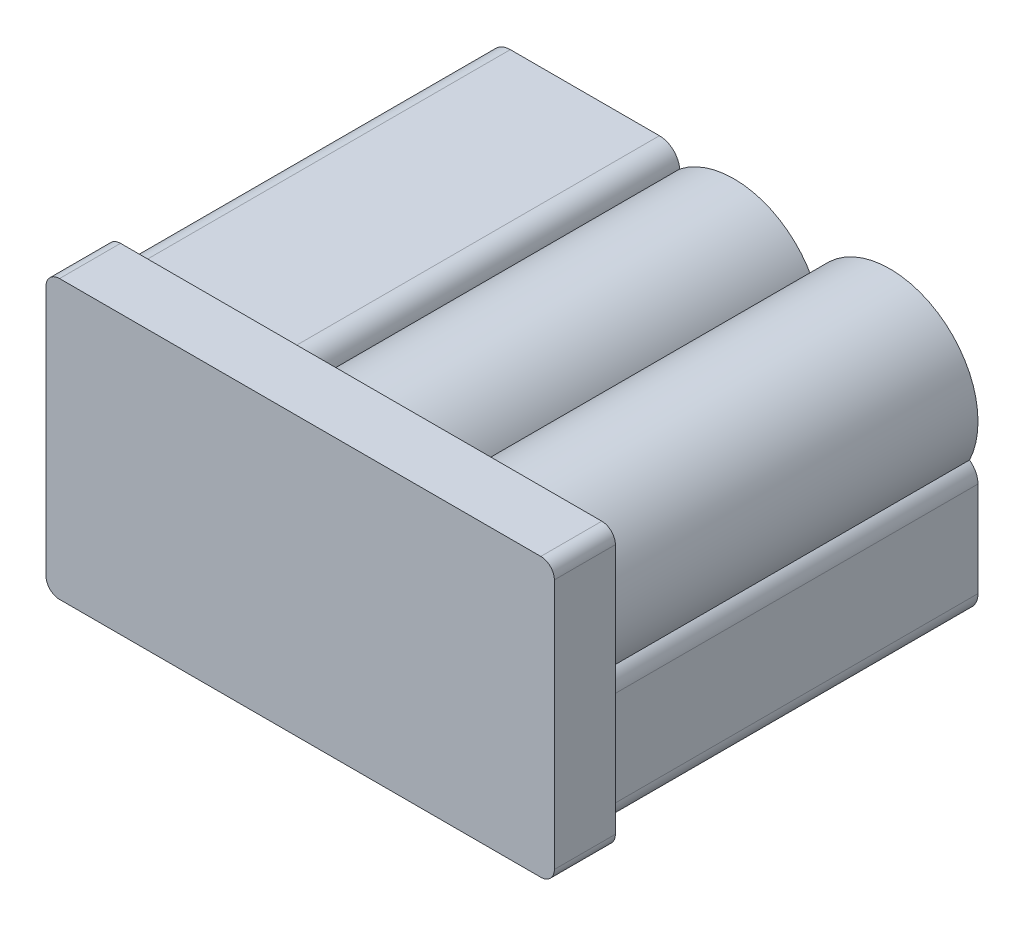
ISO-10303-21;
HEADER;
FILE_DESCRIPTION(('STEP AP214'),'2;1');
FILE_NAME('part.step','',(''),(''),'','','');
FILE_SCHEMA(('AUTOMOTIVE_DESIGN { 1 0 10303 214 1 1 1 1 }'));
ENDSEC;
DATA;
#1=APPLICATION_CONTEXT('core data for automotive mechanical design processes');
#2=APPLICATION_PROTOCOL_DEFINITION('international standard','automotive_design',2000,#1);
#3=PRODUCT_CONTEXT('',#1,'mechanical');
#4=PRODUCT('Part','Part','',(#3));
#5=PRODUCT_RELATED_PRODUCT_CATEGORY('part','',(#4));
#6=PRODUCT_DEFINITION_FORMATION('','',#4);
#7=PRODUCT_DEFINITION_CONTEXT('part definition',#1,'design');
#8=PRODUCT_DEFINITION('design','',#6,#7);
#9=PRODUCT_DEFINITION_SHAPE('','',#8);
#10=(LENGTH_UNIT() NAMED_UNIT(*) SI_UNIT(.MILLI.,.METRE.));
#11=(NAMED_UNIT(*) PLANE_ANGLE_UNIT() SI_UNIT($,.RADIAN.));
#12=(NAMED_UNIT(*) SI_UNIT($,.STERADIAN.) SOLID_ANGLE_UNIT());
#13=UNCERTAINTY_MEASURE_WITH_UNIT(LENGTH_MEASURE(1.E-05),#10,'distance_accuracy_value','');
#14=(GEOMETRIC_REPRESENTATION_CONTEXT(3) GLOBAL_UNCERTAINTY_ASSIGNED_CONTEXT((#13)) GLOBAL_UNIT_ASSIGNED_CONTEXT((#10,
#11,#12)) REPRESENTATION_CONTEXT('',''));
#15=CARTESIAN_POINT('',(0.,0.,0.));
#16=DIRECTION('',(0.,0.,1.));
#17=DIRECTION('',(1.,0.,0.));
#18=AXIS2_PLACEMENT_3D('',#15,#16,#17);
#19=CARTESIAN_POINT('',(119.0625,-65.0875,203.2));
#20=DIRECTION('',(-1.,0.,0.));
#21=DIRECTION('',(0.,0.,1.));
#22=AXIS2_PLACEMENT_3D('',#19,#20,#21);
#23=PLANE('',#22);
#24=DIRECTION('',(0.,1.,0.));
#25=VECTOR('',#24,1.);
#26=CARTESIAN_POINT('',(119.0625,-65.0875,203.2));
#27=LINE('',#26,#25);
#28=CARTESIAN_POINT('',(119.0625,-58.7375,203.2));
#29=VERTEX_POINT('',#28);
#30=CARTESIAN_POINT('',(119.0625,58.7375,203.2));
#31=VERTEX_POINT('',#30);
#32=EDGE_CURVE('E293',#29,#31,#27,.T.);
#33=ORIENTED_EDGE('',*,*,#32,.F.);
#34=DIRECTION('',(0.,0.,-1.));
#35=VECTOR('',#34,1.);
#36=CARTESIAN_POINT('',(119.0625,-58.7375,203.2));
#37=LINE('',#36,#35);
#38=CARTESIAN_POINT('',(119.0625,-58.7375,174.625));
#39=VERTEX_POINT('',#38);
#40=EDGE_CURVE('E11',#29,#39,#37,.T.);
#41=ORIENTED_EDGE('',*,*,#40,.T.);
#42=DIRECTION('',(0.,-1.,0.));
#43=VECTOR('',#42,1.);
#44=CARTESIAN_POINT('',(119.0625,0.,174.625));
#45=LINE('',#44,#43);
#46=CARTESIAN_POINT('',(119.0625,58.7375,174.625));
#47=VERTEX_POINT('',#46);
#48=EDGE_CURVE('E245',#47,#39,#45,.T.);
#49=ORIENTED_EDGE('',*,*,#48,.F.);
#50=DIRECTION('',(0.,0.,-1.));
#51=VECTOR('',#50,1.);
#52=CARTESIAN_POINT('',(119.0625,58.7375,203.2));
#53=LINE('',#52,#51);
#54=EDGE_CURVE('E44',#47,#31,#53,.F.);
#55=ORIENTED_EDGE('',*,*,#54,.T.);
#56=EDGE_LOOP('',(#33,#41,#49,#55));
#57=FACE_BOUND('',#56,.T.);
#58=ADVANCED_FACE('F36',(#57),#23,.F.);
#59=CARTESIAN_POINT('',(-119.0625,65.0875,203.2));
#60=DIRECTION('',(0.,-1.,0.));
#61=DIRECTION('',(0.,0.,-1.));
#62=AXIS2_PLACEMENT_3D('',#59,#60,#61);
#63=PLANE('',#62);
#64=DIRECTION('',(1.,0.,0.));
#65=VECTOR('',#64,1.);
#66=CARTESIAN_POINT('',(-211.228306266812,65.0875,174.625));
#67=LINE('',#66,#65);
#68=CARTESIAN_POINT('',(-112.7125,65.0875,174.625));
#69=VERTEX_POINT('',#68);
#70=CARTESIAN_POINT('',(112.7125,65.0875,174.625));
#71=VERTEX_POINT('',#70);
#72=EDGE_CURVE('E242',#69,#71,#67,.T.);
#73=ORIENTED_EDGE('',*,*,#72,.F.);
#74=DIRECTION('',(0.,0.,-1.));
#75=VECTOR('',#74,1.);
#76=CARTESIAN_POINT('',(-112.7125,65.0875,203.2));
#77=LINE('',#76,#75);
#78=CARTESIAN_POINT('',(-112.7125,65.0875,203.2));
#79=VERTEX_POINT('',#78);
#80=EDGE_CURVE('E51',#69,#79,#77,.F.);
#81=ORIENTED_EDGE('',*,*,#80,.T.);
#82=DIRECTION('',(-1.,0.,0.));
#83=VECTOR('',#82,1.);
#84=CARTESIAN_POINT('',(-119.0625,65.0875,203.2));
#85=LINE('',#84,#83);
#86=CARTESIAN_POINT('',(112.7125,65.0875,203.2));
#87=VERTEX_POINT('',#86);
#88=EDGE_CURVE('E318',#87,#79,#85,.T.);
#89=ORIENTED_EDGE('',*,*,#88,.F.);
#90=DIRECTION('',(0.,0.,-1.));
#91=VECTOR('',#90,1.);
#92=CARTESIAN_POINT('',(112.7125,65.0875,203.2));
#93=LINE('',#92,#91);
#94=EDGE_CURVE('E351',#87,#71,#93,.T.);
#95=ORIENTED_EDGE('',*,*,#94,.T.);
#96=EDGE_LOOP('',(#73,#81,#89,#95));
#97=FACE_BOUND('',#96,.T.);
#98=ADVANCED_FACE('F363',(#97),#63,.F.);
#99=CARTESIAN_POINT('',(-119.0625,-65.0875,203.2));
#100=DIRECTION('',(1.,0.,0.));
#101=DIRECTION('',(0.,0.,-1.));
#102=AXIS2_PLACEMENT_3D('',#99,#100,#101);
#103=PLANE('',#102);
#104=DIRECTION('',(0.,1.,0.));
#105=VECTOR('',#104,1.);
#106=CARTESIAN_POINT('',(-119.0625,0.,174.625));
#107=LINE('',#106,#105);
#108=CARTESIAN_POINT('',(-119.0625,-58.7375,174.625));
#109=VERTEX_POINT('',#108);
#110=CARTESIAN_POINT('',(-119.0625,58.7375,174.625));
#111=VERTEX_POINT('',#110);
#112=EDGE_CURVE('E198',#109,#111,#107,.T.);
#113=ORIENTED_EDGE('',*,*,#112,.F.);
#114=DIRECTION('',(0.,0.,-1.));
#115=VECTOR('',#114,1.);
#116=CARTESIAN_POINT('',(-119.0625,-58.7375,203.2));
#117=LINE('',#116,#115);
#118=CARTESIAN_POINT('',(-119.0625,-58.7375,203.2));
#119=VERTEX_POINT('',#118);
#120=EDGE_CURVE('E342',#109,#119,#117,.F.);
#121=ORIENTED_EDGE('',*,*,#120,.T.);
#122=DIRECTION('',(0.,-1.,0.));
#123=VECTOR('',#122,1.);
#124=CARTESIAN_POINT('',(-119.0625,-65.0875,203.2));
#125=LINE('',#124,#123);
#126=CARTESIAN_POINT('',(-119.0625,58.7375,203.2));
#127=VERTEX_POINT('',#126);
#128=EDGE_CURVE('E320',#127,#119,#125,.T.);
#129=ORIENTED_EDGE('',*,*,#128,.F.);
#130=DIRECTION('',(0.,0.,-1.));
#131=VECTOR('',#130,1.);
#132=CARTESIAN_POINT('',(-119.0625,58.7375,203.2));
#133=LINE('',#132,#131);
#134=EDGE_CURVE('E339',#127,#111,#133,.T.);
#135=ORIENTED_EDGE('',*,*,#134,.T.);
#136=EDGE_LOOP('',(#113,#121,#129,#135));
#137=FACE_BOUND('',#136,.T.);
#138=ADVANCED_FACE('F371',(#137),#103,.F.);
#139=CARTESIAN_POINT('',(-119.0625,-65.0875,203.2));
#140=DIRECTION('',(0.,1.,0.));
#141=DIRECTION('',(0.,0.,1.));
#142=AXIS2_PLACEMENT_3D('',#139,#140,#141);
#143=PLANE('',#142);
#144=DIRECTION('',(1.,0.,0.));
#145=VECTOR('',#144,1.);
#146=CARTESIAN_POINT('',(-119.0625,-65.0875,203.2));
#147=LINE('',#146,#145);
#148=CARTESIAN_POINT('',(-112.7125,-65.0875,203.2));
#149=VERTEX_POINT('',#148);
#150=CARTESIAN_POINT('',(112.7125,-65.0875,203.2));
#151=VERTEX_POINT('',#150);
#152=EDGE_CURVE('E323',#149,#151,#147,.T.);
#153=ORIENTED_EDGE('',*,*,#152,.F.);
#154=DIRECTION('',(0.,0.,-1.));
#155=VECTOR('',#154,1.);
#156=CARTESIAN_POINT('',(-112.7125,-65.0875,203.2));
#157=LINE('',#156,#155);
#158=CARTESIAN_POINT('',(-112.7125,-65.0875,174.625));
#159=VERTEX_POINT('',#158);
#160=EDGE_CURVE('E328',#149,#159,#157,.T.);
#161=ORIENTED_EDGE('',*,*,#160,.T.);
#162=DIRECTION('',(-1.,0.,0.));
#163=VECTOR('',#162,1.);
#164=CARTESIAN_POINT('',(-211.228306266812,-65.0875,174.625));
#165=LINE('',#164,#163);
#166=CARTESIAN_POINT('',(112.7125,-65.0875,174.625));
#167=VERTEX_POINT('',#166);
#168=EDGE_CURVE('E248',#167,#159,#165,.T.);
#169=ORIENTED_EDGE('',*,*,#168,.F.);
#170=DIRECTION('',(0.,0.,-1.));
#171=VECTOR('',#170,1.);
#172=CARTESIAN_POINT('',(112.7125,-65.0875,203.2));
#173=LINE('',#172,#171);
#174=EDGE_CURVE('E326',#167,#151,#173,.F.);
#175=ORIENTED_EDGE('',*,*,#174,.T.);
#176=EDGE_LOOP('',(#153,#161,#169,#175));
#177=FACE_BOUND('',#176,.T.);
#178=ADVANCED_FACE('F380',(#177),#143,.F.);
#179=CARTESIAN_POINT('',(119.0625,65.0875,203.2));
#180=DIRECTION('',(0.,0.,-1.));
#181=DIRECTION('',(-1.,0.,0.));
#182=AXIS2_PLACEMENT_3D('',#179,#180,#181);
#183=PLANE('',#182);
#184=ORIENTED_EDGE('',*,*,#128,.T.);
#185=CARTESIAN_POINT('',(-112.7125,-58.7375,203.2));
#186=DIRECTION('',(0.,0.,-1.));
#187=DIRECTION('',(-1.,0.,0.));
#188=AXIS2_PLACEMENT_3D('',#185,#186,#187);
#189=CIRCLE('',#188,6.35);
#190=EDGE_CURVE('E349',#119,#149,#189,.F.);
#191=ORIENTED_EDGE('',*,*,#190,.T.);
#192=ORIENTED_EDGE('',*,*,#152,.T.);
#193=CARTESIAN_POINT('',(112.7125,-58.7375,203.2));
#194=DIRECTION('',(0.,0.,-1.));
#195=DIRECTION('',(-1.,0.,0.));
#196=AXIS2_PLACEMENT_3D('',#193,#194,#195);
#197=CIRCLE('',#196,6.35);
#198=EDGE_CURVE('E345',#151,#29,#197,.F.);
#199=ORIENTED_EDGE('',*,*,#198,.T.);
#200=ORIENTED_EDGE('',*,*,#32,.T.);
#201=CARTESIAN_POINT('',(112.7125,58.7375,203.2));
#202=DIRECTION('',(0.,0.,-1.));
#203=DIRECTION('',(-1.,0.,0.));
#204=AXIS2_PLACEMENT_3D('',#201,#202,#203);
#205=CIRCLE('',#204,6.35);
#206=EDGE_CURVE('E58',#31,#87,#205,.F.);
#207=ORIENTED_EDGE('',*,*,#206,.T.);
#208=ORIENTED_EDGE('',*,*,#88,.T.);
#209=CARTESIAN_POINT('',(-112.7125,58.7375,203.2));
#210=DIRECTION('',(0.,0.,-1.));
#211=DIRECTION('',(-1.,0.,0.));
#212=AXIS2_PLACEMENT_3D('',#209,#210,#211);
#213=CIRCLE('',#212,6.35);
#214=EDGE_CURVE('E347',#79,#127,#213,.F.);
#215=ORIENTED_EDGE('',*,*,#214,.T.);
#216=EDGE_LOOP('',(#184,#191,#192,#199,#200,#207,#208,#215));
#217=FACE_BOUND('',#216,.T.);
#218=ADVANCED_FACE('F360',(#217),#183,.F.);
#219=CARTESIAN_POINT('',(104.775,-50.8,174.625));
#220=DIRECTION('',(0.,0.,-1.));
#221=DIRECTION('',(-1.,0.,0.));
#222=AXIS2_PLACEMENT_3D('',#219,#220,#221);
#223=CYLINDRICAL_SURFACE('',#222,9.52499999999999);
#224=CARTESIAN_POINT('',(104.775,-50.8,0.));
#225=DIRECTION('',(0.,0.,-1.));
#226=DIRECTION('',(-1.,0.,0.));
#227=AXIS2_PLACEMENT_3D('',#224,#225,#226);
#228=CIRCLE('',#227,9.52499999999999);
#229=CARTESIAN_POINT('',(114.3,-50.8,0.));
#230=VERTEX_POINT('',#229);
#231=CARTESIAN_POINT('',(104.775,-60.325,0.));
#232=VERTEX_POINT('',#231);
#233=EDGE_CURVE('E192',#230,#232,#228,.T.);
#234=ORIENTED_EDGE('',*,*,#233,.F.);
#235=DIRECTION('',(0.,0.,-1.));
#236=VECTOR('',#235,1.);
#237=CARTESIAN_POINT('',(114.3,-50.8,174.625));
#238=LINE('',#237,#236);
#239=CARTESIAN_POINT('',(114.3,-50.8,174.625));
#240=VERTEX_POINT('',#239);
#241=EDGE_CURVE('E186',#240,#230,#238,.T.);
#242=ORIENTED_EDGE('',*,*,#241,.F.);
#243=CARTESIAN_POINT('',(104.775,-50.8,174.625));
#244=DIRECTION('',(0.,0.,-1.));
#245=DIRECTION('',(-1.,0.,0.));
#246=AXIS2_PLACEMENT_3D('',#243,#244,#245);
#247=CIRCLE('',#246,9.52499999999999);
#248=CARTESIAN_POINT('',(104.775,-60.325,174.625));
#249=VERTEX_POINT('',#248);
#250=EDGE_CURVE('E189',#240,#249,#247,.T.);
#251=ORIENTED_EDGE('',*,*,#250,.T.);
#252=DIRECTION('',(0.,0.,-1.));
#253=VECTOR('',#252,1.);
#254=CARTESIAN_POINT('',(104.775,-60.325,174.625));
#255=LINE('',#254,#253);
#256=EDGE_CURVE('E291',#249,#232,#255,.T.);
#257=ORIENTED_EDGE('',*,*,#256,.T.);
#258=EDGE_LOOP('',(#234,#242,#251,#257));
#259=FACE_BOUND('',#258,.T.);
#260=ADVANCED_FACE('F188',(#259),#223,.T.);
#261=CARTESIAN_POINT('',(-211.228306266812,-60.325,174.625));
#262=DIRECTION('',(0.,1.,0.));
#263=DIRECTION('',(0.,0.,1.));
#264=AXIS2_PLACEMENT_3D('',#261,#262,#263);
#265=PLANE('',#264);
#266=DIRECTION('',(1.,0.,0.));
#267=VECTOR('',#266,1.);
#268=CARTESIAN_POINT('',(-211.228306266812,-60.325,0.));
#269=LINE('',#268,#267);
#270=CARTESIAN_POINT('',(34.925,-60.325,0.));
#271=VERTEX_POINT('',#270);
#272=EDGE_CURVE('E210',#271,#232,#269,.T.);
#273=ORIENTED_EDGE('',*,*,#272,.T.);
#274=ORIENTED_EDGE('',*,*,#256,.F.);
#275=DIRECTION('',(1.,0.,0.));
#276=VECTOR('',#275,1.);
#277=CARTESIAN_POINT('',(-211.228306266812,-60.325,174.625));
#278=LINE('',#277,#276);
#279=CARTESIAN_POINT('',(34.925,-60.325,174.625));
#280=VERTEX_POINT('',#279);
#281=EDGE_CURVE('E209',#280,#249,#278,.T.);
#282=ORIENTED_EDGE('',*,*,#281,.F.);
#283=DIRECTION('',(0.,0.,-1.));
#284=VECTOR('',#283,1.);
#285=CARTESIAN_POINT('',(34.925,-60.325,174.625));
#286=LINE('',#285,#284);
#287=EDGE_CURVE('E294',#280,#271,#286,.T.);
#288=ORIENTED_EDGE('',*,*,#287,.T.);
#289=EDGE_LOOP('',(#273,#274,#282,#288));
#290=FACE_BOUND('',#289,.T.);
#291=ADVANCED_FACE('F434',(#290),#265,.F.);
#292=CARTESIAN_POINT('',(34.925,-50.8,174.625));
#293=DIRECTION('',(0.,0.,-1.));
#294=DIRECTION('',(-1.,0.,0.));
#295=AXIS2_PLACEMENT_3D('',#292,#293,#294);
#296=CYLINDRICAL_SURFACE('',#295,9.525);
#297=CARTESIAN_POINT('',(34.925,-50.8,0.));
#298=DIRECTION('',(0.,0.,-1.));
#299=DIRECTION('',(-1.,0.,0.));
#300=AXIS2_PLACEMENT_3D('',#297,#298,#299);
#301=CIRCLE('',#300,9.525);
#302=CARTESIAN_POINT('',(25.4303939722906,-51.5603166304803,0.));
#303=VERTEX_POINT('',#302);
#304=EDGE_CURVE('E286',#303,#271,#301,.F.);
#305=ORIENTED_EDGE('',*,*,#304,.T.);
#306=ORIENTED_EDGE('',*,*,#287,.F.);
#307=CARTESIAN_POINT('',(34.925,-50.8,174.625));
#308=DIRECTION('',(0.,0.,-1.));
#309=DIRECTION('',(-1.,0.,0.));
#310=AXIS2_PLACEMENT_3D('',#307,#308,#309);
#311=CIRCLE('',#310,9.525);
#312=CARTESIAN_POINT('',(25.4303939722906,-51.5603166304803,174.625));
#313=VERTEX_POINT('',#312);
#314=EDGE_CURVE('E239',#313,#280,#311,.F.);
#315=ORIENTED_EDGE('',*,*,#314,.F.);
#316=DIRECTION('',(0.,0.,-1.));
#317=VECTOR('',#316,1.);
#318=CARTESIAN_POINT('',(25.4303939722906,-51.5603166304803,174.625));
#319=LINE('',#318,#317);
#320=EDGE_CURVE('E296',#313,#303,#319,.T.);
#321=ORIENTED_EDGE('',*,*,#320,.T.);
#322=EDGE_LOOP('',(#305,#306,#315,#321));
#323=FACE_BOUND('',#322,.T.);
#324=ADVANCED_FACE('F440',(#323),#296,.T.);
#325=CARTESIAN_POINT('',(0.,-19.05,174.625));
#326=DIRECTION('',(0.,0.,-1.));
#327=DIRECTION('',(-1.,0.,0.));
#328=AXIS2_PLACEMENT_3D('',#325,#326,#327);
#329=CYLINDRICAL_SURFACE('',#328,41.275);
#330=CARTESIAN_POINT('',(0.,-19.05,0.));
#331=DIRECTION('',(0.,0.,-1.));
#332=DIRECTION('',(-1.,0.,0.));
#333=AXIS2_PLACEMENT_3D('',#330,#331,#332);
#334=CIRCLE('',#333,41.275);
#335=CARTESIAN_POINT('',(-36.5125,-38.2974145991091,0.));
#336=VERTEX_POINT('',#335);
#337=EDGE_CURVE('E283',#303,#336,#334,.T.);
#338=ORIENTED_EDGE('',*,*,#337,.F.);
#339=ORIENTED_EDGE('',*,*,#320,.F.);
#340=CARTESIAN_POINT('',(0.,-19.05,174.625));
#341=DIRECTION('',(0.,0.,-1.));
#342=DIRECTION('',(-1.,0.,0.));
#343=AXIS2_PLACEMENT_3D('',#340,#341,#342);
#344=CIRCLE('',#343,41.275);
#345=CARTESIAN_POINT('',(-36.5125,-38.2974145991091,174.625));
#346=VERTEX_POINT('',#345);
#347=EDGE_CURVE('E237',#313,#346,#344,.T.);
#348=ORIENTED_EDGE('',*,*,#347,.T.);
#349=DIRECTION('',(0.,0.,-1.));
#350=VECTOR('',#349,1.);
#351=CARTESIAN_POINT('',(-36.5125,-38.2974145991091,174.625));
#352=LINE('',#351,#350);
#353=EDGE_CURVE('E298',#346,#336,#352,.T.);
#354=ORIENTED_EDGE('',*,*,#353,.T.);
#355=EDGE_LOOP('',(#338,#339,#348,#354));
#356=FACE_BOUND('',#355,.T.);
#357=ADVANCED_FACE('F448',(#356),#329,.T.);
#358=CARTESIAN_POINT('',(-73.025,-19.05,174.625));
#359=DIRECTION('',(0.,0.,-1.));
#360=DIRECTION('',(-1.,0.,0.));
#361=AXIS2_PLACEMENT_3D('',#358,#359,#360);
#362=CYLINDRICAL_SURFACE('',#361,41.275);
#363=CARTESIAN_POINT('',(-73.025,-19.05,0.));
#364=DIRECTION('',(0.,0.,-1.));
#365=DIRECTION('',(-1.,0.,0.));
#366=AXIS2_PLACEMENT_3D('',#363,#364,#365);
#367=CIRCLE('',#366,41.275);
#368=CARTESIAN_POINT('',(-110.329957106934,-1.38744638366728,0.));
#369=VERTEX_POINT('',#368);
#370=EDGE_CURVE('E280',#336,#369,#367,.T.);
#371=ORIENTED_EDGE('',*,*,#370,.F.);
#372=ORIENTED_EDGE('',*,*,#353,.F.);
#373=CARTESIAN_POINT('',(-73.025,-19.05,174.625));
#374=DIRECTION('',(0.,0.,-1.));
#375=DIRECTION('',(-1.,0.,0.));
#376=AXIS2_PLACEMENT_3D('',#373,#374,#375);
#377=CIRCLE('',#376,41.275);
#378=CARTESIAN_POINT('',(-110.329957106934,-1.38744638366728,174.625));
#379=VERTEX_POINT('',#378);
#380=EDGE_CURVE('E235',#346,#379,#377,.T.);
#381=ORIENTED_EDGE('',*,*,#380,.T.);
#382=DIRECTION('',(0.,0.,-1.));
#383=VECTOR('',#382,1.);
#384=CARTESIAN_POINT('',(-110.329957106934,-1.38744638366728,174.625));
#385=LINE('',#384,#383);
#386=EDGE_CURVE('E300',#379,#369,#385,.T.);
#387=ORIENTED_EDGE('',*,*,#386,.T.);
#388=EDGE_LOOP('',(#371,#372,#381,#387));
#389=FACE_BOUND('',#388,.T.);
#390=ADVANCED_FACE('F456',(#389),#362,.T.);
#391=CARTESIAN_POINT('',(-104.775,6.34999999999999,174.625));
#392=DIRECTION('',(0.,0.,-1.));
#393=DIRECTION('',(-1.,0.,0.));
#394=AXIS2_PLACEMENT_3D('',#391,#392,#393);
#395=CYLINDRICAL_SURFACE('',#394,9.525);
#396=CARTESIAN_POINT('',(-104.775,6.34999999999999,0.));
#397=DIRECTION('',(0.,0.,-1.));
#398=DIRECTION('',(-1.,0.,0.));
#399=AXIS2_PLACEMENT_3D('',#396,#397,#398);
#400=CIRCLE('',#399,9.525);
#401=CARTESIAN_POINT('',(-114.3,6.34999999999999,0.));
#402=VERTEX_POINT('',#401);
#403=EDGE_CURVE('E277',#369,#402,#400,.T.);
#404=ORIENTED_EDGE('',*,*,#403,.F.);
#405=ORIENTED_EDGE('',*,*,#386,.F.);
#406=CARTESIAN_POINT('',(-104.775,6.34999999999999,174.625));
#407=DIRECTION('',(0.,0.,-1.));
#408=DIRECTION('',(-1.,0.,0.));
#409=AXIS2_PLACEMENT_3D('',#406,#407,#408);
#410=CIRCLE('',#409,9.525);
#411=CARTESIAN_POINT('',(-114.3,6.34999999999999,174.625));
#412=VERTEX_POINT('',#411);
#413=EDGE_CURVE('E233',#379,#412,#410,.T.);
#414=ORIENTED_EDGE('',*,*,#413,.T.);
#415=DIRECTION('',(0.,0.,-1.));
#416=VECTOR('',#415,1.);
#417=CARTESIAN_POINT('',(-114.3,6.34999999999999,174.625));
#418=LINE('',#417,#416);
#419=EDGE_CURVE('E302',#412,#402,#418,.T.);
#420=ORIENTED_EDGE('',*,*,#419,.T.);
#421=EDGE_LOOP('',(#404,#405,#414,#420));
#422=FACE_BOUND('',#421,.T.);
#423=ADVANCED_FACE('F464',(#422),#395,.T.);
#424=CARTESIAN_POINT('',(-114.3,0.,174.625));
#425=DIRECTION('',(-1.,0.,0.));
#426=DIRECTION('',(0.,0.,1.));
#427=AXIS2_PLACEMENT_3D('',#424,#425,#426);
#428=PLANE('',#427);
#429=DIRECTION('',(0.,1.,0.));
#430=VECTOR('',#429,1.);
#431=CARTESIAN_POINT('',(-114.3,0.,0.));
#432=LINE('',#431,#430);
#433=CARTESIAN_POINT('',(-114.3,50.8,0.));
#434=VERTEX_POINT('',#433);
#435=EDGE_CURVE('E274',#402,#434,#432,.T.);
#436=ORIENTED_EDGE('',*,*,#435,.F.);
#437=ORIENTED_EDGE('',*,*,#419,.F.);
#438=DIRECTION('',(0.,1.,0.));
#439=VECTOR('',#438,1.);
#440=CARTESIAN_POINT('',(-114.3,0.,174.625));
#441=LINE('',#440,#439);
#442=CARTESIAN_POINT('',(-114.3,50.8,174.625));
#443=VERTEX_POINT('',#442);
#444=EDGE_CURVE('E231',#412,#443,#441,.T.);
#445=ORIENTED_EDGE('',*,*,#444,.T.);
#446=DIRECTION('',(0.,0.,-1.));
#447=VECTOR('',#446,1.);
#448=CARTESIAN_POINT('',(-114.3,50.8,174.625));
#449=LINE('',#448,#447);
#450=EDGE_CURVE('E304',#443,#434,#449,.T.);
#451=ORIENTED_EDGE('',*,*,#450,.T.);
#452=EDGE_LOOP('',(#436,#437,#445,#451));
#453=FACE_BOUND('',#452,.T.);
#454=ADVANCED_FACE('F472',(#453),#428,.T.);
#455=CARTESIAN_POINT('',(-104.775,50.8,174.625));
#456=DIRECTION('',(0.,0.,-1.));
#457=DIRECTION('',(-1.,0.,0.));
#458=AXIS2_PLACEMENT_3D('',#455,#456,#457);
#459=CYLINDRICAL_SURFACE('',#458,9.525);
#460=CARTESIAN_POINT('',(-104.775,50.8,0.));
#461=DIRECTION('',(0.,0.,-1.));
#462=DIRECTION('',(-1.,0.,0.));
#463=AXIS2_PLACEMENT_3D('',#460,#461,#462);
#464=CIRCLE('',#463,9.525);
#465=CARTESIAN_POINT('',(-104.775,60.325,0.));
#466=VERTEX_POINT('',#465);
#467=EDGE_CURVE('E271',#466,#434,#464,.F.);
#468=ORIENTED_EDGE('',*,*,#467,.T.);
#469=ORIENTED_EDGE('',*,*,#450,.F.);
#470=CARTESIAN_POINT('',(-104.775,50.8,174.625));
#471=DIRECTION('',(0.,0.,-1.));
#472=DIRECTION('',(-1.,0.,0.));
#473=AXIS2_PLACEMENT_3D('',#470,#471,#472);
#474=CIRCLE('',#473,9.525);
#475=CARTESIAN_POINT('',(-104.775,60.325,174.625));
#476=VERTEX_POINT('',#475);
#477=EDGE_CURVE('E228',#476,#443,#474,.F.);
#478=ORIENTED_EDGE('',*,*,#477,.F.);
#479=DIRECTION('',(0.,0.,-1.));
#480=VECTOR('',#479,1.);
#481=CARTESIAN_POINT('',(-104.775,60.325,174.625));
#482=LINE('',#481,#480);
#483=EDGE_CURVE('E306',#476,#466,#482,.T.);
#484=ORIENTED_EDGE('',*,*,#483,.T.);
#485=EDGE_LOOP('',(#468,#469,#478,#484));
#486=FACE_BOUND('',#485,.T.);
#487=ADVANCED_FACE('F480',(#486),#459,.T.);
#488=CARTESIAN_POINT('',(-211.228306266812,60.325,174.625));
#489=DIRECTION('',(0.,-1.,0.));
#490=DIRECTION('',(1.,0.,0.));
#491=AXIS2_PLACEMENT_3D('',#488,#489,#490);
#492=PLANE('',#491);
#493=DIRECTION('',(-1.,0.,0.));
#494=VECTOR('',#493,1.);
#495=CARTESIAN_POINT('',(-211.228306266812,60.325,0.));
#496=LINE('',#495,#494);
#497=CARTESIAN_POINT('',(-34.925,60.325,0.));
#498=VERTEX_POINT('',#497);
#499=EDGE_CURVE('E268',#498,#466,#496,.T.);
#500=ORIENTED_EDGE('',*,*,#499,.T.);
#501=ORIENTED_EDGE('',*,*,#483,.F.);
#502=DIRECTION('',(-1.,0.,0.));
#503=VECTOR('',#502,1.);
#504=CARTESIAN_POINT('',(-211.228306266812,60.325,174.625));
#505=LINE('',#504,#503);
#506=CARTESIAN_POINT('',(-34.925,60.325,174.625));
#507=VERTEX_POINT('',#506);
#508=EDGE_CURVE('E225',#507,#476,#505,.T.);
#509=ORIENTED_EDGE('',*,*,#508,.F.);
#510=DIRECTION('',(0.,0.,-1.));
#511=VECTOR('',#510,1.);
#512=CARTESIAN_POINT('',(-34.925,60.325,174.625));
#513=LINE('',#512,#511);
#514=EDGE_CURVE('E308',#507,#498,#513,.T.);
#515=ORIENTED_EDGE('',*,*,#514,.T.);
#516=EDGE_LOOP('',(#500,#501,#509,#515));
#517=FACE_BOUND('',#516,.T.);
#518=ADVANCED_FACE('F488',(#517),#492,.F.);
#519=CARTESIAN_POINT('',(-34.925,50.8,174.625));
#520=DIRECTION('',(0.,0.,-1.));
#521=DIRECTION('',(-1.,0.,0.));
#522=AXIS2_PLACEMENT_3D('',#519,#520,#521);
#523=CYLINDRICAL_SURFACE('',#522,9.525);
#524=CARTESIAN_POINT('',(-34.925,50.8,0.));
#525=DIRECTION('',(0.,0.,-1.));
#526=DIRECTION('',(-1.,0.,0.));
#527=AXIS2_PLACEMENT_3D('',#524,#525,#526);
#528=CIRCLE('',#527,9.525);
#529=CARTESIAN_POINT('',(-25.4303939722907,51.5603166304803,0.));
#530=VERTEX_POINT('',#529);
#531=EDGE_CURVE('E265',#530,#498,#528,.F.);
#532=ORIENTED_EDGE('',*,*,#531,.T.);
#533=ORIENTED_EDGE('',*,*,#514,.F.);
#534=CARTESIAN_POINT('',(-34.925,50.8,174.625));
#535=DIRECTION('',(0.,0.,-1.));
#536=DIRECTION('',(-1.,0.,0.));
#537=AXIS2_PLACEMENT_3D('',#534,#535,#536);
#538=CIRCLE('',#537,9.525);
#539=CARTESIAN_POINT('',(-25.4303939722907,51.5603166304803,174.625));
#540=VERTEX_POINT('',#539);
#541=EDGE_CURVE('E222',#540,#507,#538,.F.);
#542=ORIENTED_EDGE('',*,*,#541,.F.);
#543=DIRECTION('',(0.,0.,-1.));
#544=VECTOR('',#543,1.);
#545=CARTESIAN_POINT('',(-25.4303939722907,51.5603166304803,174.625));
#546=LINE('',#545,#544);
#547=EDGE_CURVE('E310',#540,#530,#546,.T.);
#548=ORIENTED_EDGE('',*,*,#547,.T.);
#549=EDGE_LOOP('',(#532,#533,#542,#548));
#550=FACE_BOUND('',#549,.T.);
#551=ADVANCED_FACE('F496',(#550),#523,.T.);
#552=CARTESIAN_POINT('',(0.,19.05,174.625));
#553=DIRECTION('',(0.,0.,-1.));
#554=DIRECTION('',(-1.,0.,0.));
#555=AXIS2_PLACEMENT_3D('',#552,#553,#554);
#556=CYLINDRICAL_SURFACE('',#555,41.275);
#557=CARTESIAN_POINT('',(0.,19.05,0.));
#558=DIRECTION('',(0.,0.,-1.));
#559=DIRECTION('',(-1.,0.,0.));
#560=AXIS2_PLACEMENT_3D('',#557,#558,#559);
#561=CIRCLE('',#560,41.275);
#562=CARTESIAN_POINT('',(36.5125,38.2974145991092,0.));
#563=VERTEX_POINT('',#562);
#564=EDGE_CURVE('E262',#530,#563,#561,.T.);
#565=ORIENTED_EDGE('',*,*,#564,.F.);
#566=ORIENTED_EDGE('',*,*,#547,.F.);
#567=CARTESIAN_POINT('',(0.,19.05,174.625));
#568=DIRECTION('',(0.,0.,-1.));
#569=DIRECTION('',(-1.,0.,0.));
#570=AXIS2_PLACEMENT_3D('',#567,#568,#569);
#571=CIRCLE('',#570,41.275);
#572=CARTESIAN_POINT('',(36.5125,38.2974145991092,174.625));
#573=VERTEX_POINT('',#572);
#574=EDGE_CURVE('E220',#540,#573,#571,.T.);
#575=ORIENTED_EDGE('',*,*,#574,.T.);
#576=DIRECTION('',(0.,0.,-1.));
#577=VECTOR('',#576,1.);
#578=CARTESIAN_POINT('',(36.5125,38.2974145991092,174.625));
#579=LINE('',#578,#577);
#580=EDGE_CURVE('E312',#573,#563,#579,.T.);
#581=ORIENTED_EDGE('',*,*,#580,.T.);
#582=EDGE_LOOP('',(#565,#566,#575,#581));
#583=FACE_BOUND('',#582,.T.);
#584=ADVANCED_FACE('F504',(#583),#556,.T.);
#585=CARTESIAN_POINT('',(73.025,19.05,174.625));
#586=DIRECTION('',(0.,0.,-1.));
#587=DIRECTION('',(-1.,0.,0.));
#588=AXIS2_PLACEMENT_3D('',#585,#586,#587);
#589=CYLINDRICAL_SURFACE('',#588,41.275);
#590=CARTESIAN_POINT('',(73.025,19.05,0.));
#591=DIRECTION('',(0.,0.,-1.));
#592=DIRECTION('',(-1.,0.,0.));
#593=AXIS2_PLACEMENT_3D('',#590,#591,#592);
#594=CIRCLE('',#593,41.275);
#595=CARTESIAN_POINT('',(110.329957106934,1.38744638366725,0.));
#596=VERTEX_POINT('',#595);
#597=EDGE_CURVE('E259',#563,#596,#594,.T.);
#598=ORIENTED_EDGE('',*,*,#597,.F.);
#599=ORIENTED_EDGE('',*,*,#580,.F.);
#600=CARTESIAN_POINT('',(73.025,19.05,174.625));
#601=DIRECTION('',(0.,0.,-1.));
#602=DIRECTION('',(-1.,0.,0.));
#603=AXIS2_PLACEMENT_3D('',#600,#601,#602);
#604=CIRCLE('',#603,41.275);
#605=CARTESIAN_POINT('',(110.329957106934,1.38744638366725,174.625));
#606=VERTEX_POINT('',#605);
#607=EDGE_CURVE('E216',#573,#606,#604,.T.);
#608=ORIENTED_EDGE('',*,*,#607,.T.);
#609=DIRECTION('',(0.,0.,-1.));
#610=VECTOR('',#609,1.);
#611=CARTESIAN_POINT('',(110.329957106934,1.38744638366725,174.625));
#612=LINE('',#611,#610);
#613=EDGE_CURVE('E314',#606,#596,#612,.T.);
#614=ORIENTED_EDGE('',*,*,#613,.T.);
#615=EDGE_LOOP('',(#598,#599,#608,#614));
#616=FACE_BOUND('',#615,.T.);
#617=ADVANCED_FACE('F512',(#616),#589,.T.);
#618=CARTESIAN_POINT('',(104.775,-6.35,174.625));
#619=DIRECTION('',(0.,0.,-1.));
#620=DIRECTION('',(-1.,0.,0.));
#621=AXIS2_PLACEMENT_3D('',#618,#619,#620);
#622=CYLINDRICAL_SURFACE('',#621,9.52500000000001);
#623=CARTESIAN_POINT('',(104.775,-6.35,0.));
#624=DIRECTION('',(0.,0.,-1.));
#625=DIRECTION('',(-1.,0.,0.));
#626=AXIS2_PLACEMENT_3D('',#623,#624,#625);
#627=CIRCLE('',#626,9.52500000000001);
#628=CARTESIAN_POINT('',(114.3,-6.35,0.));
#629=VERTEX_POINT('',#628);
#630=EDGE_CURVE('E256',#629,#596,#627,.F.);
#631=ORIENTED_EDGE('',*,*,#630,.T.);
#632=ORIENTED_EDGE('',*,*,#613,.F.);
#633=CARTESIAN_POINT('',(104.775,-6.35,174.625));
#634=DIRECTION('',(0.,0.,-1.));
#635=DIRECTION('',(-1.,0.,0.));
#636=AXIS2_PLACEMENT_3D('',#633,#634,#635);
#637=CIRCLE('',#636,9.52500000000001);
#638=CARTESIAN_POINT('',(114.3,-6.35,174.625));
#639=VERTEX_POINT('',#638);
#640=EDGE_CURVE('E214',#639,#606,#637,.F.);
#641=ORIENTED_EDGE('',*,*,#640,.F.);
#642=DIRECTION('',(0.,0.,-1.));
#643=VECTOR('',#642,1.);
#644=CARTESIAN_POINT('',(114.3,-6.35,174.625));
#645=LINE('',#644,#643);
#646=EDGE_CURVE('E197',#639,#629,#645,.T.);
#647=ORIENTED_EDGE('',*,*,#646,.T.);
#648=EDGE_LOOP('',(#631,#632,#641,#647));
#649=FACE_BOUND('',#648,.T.);
#650=ADVANCED_FACE('F520',(#649),#622,.T.);
#651=CARTESIAN_POINT('',(114.3,0.,174.625));
#652=DIRECTION('',(-1.,0.,0.));
#653=DIRECTION('',(0.,0.,1.));
#654=AXIS2_PLACEMENT_3D('',#651,#652,#653);
#655=PLANE('',#654);
#656=DIRECTION('',(0.,1.,0.));
#657=VECTOR('',#656,1.);
#658=CARTESIAN_POINT('',(114.3,0.,0.));
#659=LINE('',#658,#657);
#660=EDGE_CURVE('E254',#230,#629,#659,.T.);
#661=ORIENTED_EDGE('',*,*,#660,.T.);
#662=ORIENTED_EDGE('',*,*,#646,.F.);
#663=DIRECTION('',(0.,1.,0.));
#664=VECTOR('',#663,1.);
#665=CARTESIAN_POINT('',(114.3,0.,174.625));
#666=LINE('',#665,#664);
#667=EDGE_CURVE('E206',#240,#639,#666,.T.);
#668=ORIENTED_EDGE('',*,*,#667,.F.);
#669=ORIENTED_EDGE('',*,*,#241,.T.);
#670=EDGE_LOOP('',(#661,#662,#668,#669));
#671=FACE_BOUND('',#670,.T.);
#672=ADVANCED_FACE('F212',(#671),#655,.F.);
#673=CARTESIAN_POINT('',(-211.228306266812,0.,174.625));
#674=DIRECTION('',(0.,0.,-1.));
#675=DIRECTION('',(-1.,0.,0.));
#676=AXIS2_PLACEMENT_3D('',#673,#674,#675);
#677=PLANE('',#676);
#678=ORIENTED_EDGE('',*,*,#250,.F.);
#679=ORIENTED_EDGE('',*,*,#667,.T.);
#680=ORIENTED_EDGE('',*,*,#640,.T.);
#681=ORIENTED_EDGE('',*,*,#607,.F.);
#682=ORIENTED_EDGE('',*,*,#574,.F.);
#683=ORIENTED_EDGE('',*,*,#541,.T.);
#684=ORIENTED_EDGE('',*,*,#508,.T.);
#685=ORIENTED_EDGE('',*,*,#477,.T.);
#686=ORIENTED_EDGE('',*,*,#444,.F.);
#687=ORIENTED_EDGE('',*,*,#413,.F.);
#688=ORIENTED_EDGE('',*,*,#380,.F.);
#689=ORIENTED_EDGE('',*,*,#347,.F.);
#690=ORIENTED_EDGE('',*,*,#314,.T.);
#691=ORIENTED_EDGE('',*,*,#281,.T.);
#692=EDGE_LOOP('',(#678,#679,#680,#681,#682,#683,#684,#685,#686,#687,#688,#689,#690,#691));
#693=FACE_BOUND('',#692,.T.);
#694=ORIENTED_EDGE('',*,*,#168,.T.);
#695=CARTESIAN_POINT('',(-112.7125,-58.7375,174.625));
#696=DIRECTION('',(0.,0.,-1.));
#697=DIRECTION('',(-1.,0.,0.));
#698=AXIS2_PLACEMENT_3D('',#695,#696,#697);
#699=CIRCLE('',#698,6.35);
#700=EDGE_CURVE('E337',#159,#109,#699,.T.);
#701=ORIENTED_EDGE('',*,*,#700,.T.);
#702=ORIENTED_EDGE('',*,*,#112,.T.);
#703=CARTESIAN_POINT('',(-112.7125,58.7375,174.625));
#704=DIRECTION('',(0.,0.,-1.));
#705=DIRECTION('',(-1.,0.,0.));
#706=AXIS2_PLACEMENT_3D('',#703,#704,#705);
#707=CIRCLE('',#706,6.35);
#708=EDGE_CURVE('E335',#111,#69,#707,.T.);
#709=ORIENTED_EDGE('',*,*,#708,.T.);
#710=ORIENTED_EDGE('',*,*,#72,.T.);
#711=CARTESIAN_POINT('',(112.7125,58.7375,174.625));
#712=DIRECTION('',(0.,0.,-1.));
#713=DIRECTION('',(-1.,0.,0.));
#714=AXIS2_PLACEMENT_3D('',#711,#712,#713);
#715=CIRCLE('',#714,6.35);
#716=EDGE_CURVE('E331',#71,#47,#715,.T.);
#717=ORIENTED_EDGE('',*,*,#716,.T.);
#718=ORIENTED_EDGE('',*,*,#48,.T.);
#719=CARTESIAN_POINT('',(112.7125,-58.7375,174.625));
#720=DIRECTION('',(0.,0.,-1.));
#721=DIRECTION('',(-1.,0.,0.));
#722=AXIS2_PLACEMENT_3D('',#719,#720,#721);
#723=CIRCLE('',#722,6.35);
#724=EDGE_CURVE('E333',#39,#167,#723,.T.);
#725=ORIENTED_EDGE('',*,*,#724,.T.);
#726=EDGE_LOOP('',(#694,#701,#702,#709,#710,#717,#718,#725));
#727=FACE_BOUND('',#726,.T.);
#728=ADVANCED_FACE('F203',(#693,#727),#677,.T.);
#729=CARTESIAN_POINT('',(119.0625,65.0875,0.));
#730=DIRECTION('',(0.,0.,-1.));
#731=DIRECTION('',(-1.,0.,0.));
#732=AXIS2_PLACEMENT_3D('',#729,#730,#731);
#733=PLANE('',#732);
#734=ORIENTED_EDGE('',*,*,#660,.F.);
#735=ORIENTED_EDGE('',*,*,#233,.T.);
#736=ORIENTED_EDGE('',*,*,#272,.F.);
#737=ORIENTED_EDGE('',*,*,#304,.F.);
#738=ORIENTED_EDGE('',*,*,#337,.T.);
#739=ORIENTED_EDGE('',*,*,#370,.T.);
#740=ORIENTED_EDGE('',*,*,#403,.T.);
#741=ORIENTED_EDGE('',*,*,#435,.T.);
#742=ORIENTED_EDGE('',*,*,#467,.F.);
#743=ORIENTED_EDGE('',*,*,#499,.F.);
#744=ORIENTED_EDGE('',*,*,#531,.F.);
#745=ORIENTED_EDGE('',*,*,#564,.T.);
#746=ORIENTED_EDGE('',*,*,#597,.T.);
#747=ORIENTED_EDGE('',*,*,#630,.F.);
#748=EDGE_LOOP('',(#734,#735,#736,#737,#738,#739,#740,#741,#742,#743,#744,#745,#746,#747));
#749=FACE_BOUND('',#748,.T.);
#750=ADVANCED_FACE('F399',(#749),#733,.T.);
#751=CARTESIAN_POINT('',(-112.7125,-58.7375,203.2));
#752=DIRECTION('',(0.,0.,-1.));
#753=DIRECTION('',(-1.,0.,0.));
#754=AXIS2_PLACEMENT_3D('',#751,#752,#753);
#755=CYLINDRICAL_SURFACE('',#754,6.35);
#756=ORIENTED_EDGE('',*,*,#190,.F.);
#757=ORIENTED_EDGE('',*,*,#120,.F.);
#758=ORIENTED_EDGE('',*,*,#700,.F.);
#759=ORIENTED_EDGE('',*,*,#160,.F.);
#760=EDGE_LOOP('',(#756,#757,#758,#759));
#761=FACE_BOUND('',#760,.T.);
#762=ADVANCED_FACE('F377',(#761),#755,.T.);
#763=CARTESIAN_POINT('',(-112.7125,58.7375,203.2));
#764=DIRECTION('',(0.,0.,-1.));
#765=DIRECTION('',(-1.,0.,0.));
#766=AXIS2_PLACEMENT_3D('',#763,#764,#765);
#767=CYLINDRICAL_SURFACE('',#766,6.35);
#768=ORIENTED_EDGE('',*,*,#214,.F.);
#769=ORIENTED_EDGE('',*,*,#80,.F.);
#770=ORIENTED_EDGE('',*,*,#708,.F.);
#771=ORIENTED_EDGE('',*,*,#134,.F.);
#772=EDGE_LOOP('',(#768,#769,#770,#771));
#773=FACE_BOUND('',#772,.T.);
#774=ADVANCED_FACE('F368',(#773),#767,.T.);
#775=CARTESIAN_POINT('',(112.7125,-58.7375,203.2));
#776=DIRECTION('',(0.,0.,-1.));
#777=DIRECTION('',(-1.,0.,0.));
#778=AXIS2_PLACEMENT_3D('',#775,#776,#777);
#779=CYLINDRICAL_SURFACE('',#778,6.35);
#780=ORIENTED_EDGE('',*,*,#198,.F.);
#781=ORIENTED_EDGE('',*,*,#174,.F.);
#782=ORIENTED_EDGE('',*,*,#724,.F.);
#783=ORIENTED_EDGE('',*,*,#40,.F.);
#784=EDGE_LOOP('',(#780,#781,#782,#783));
#785=FACE_BOUND('',#784,.T.);
#786=ADVANCED_FACE('F383',(#785),#779,.T.);
#787=CARTESIAN_POINT('',(112.7125,58.7375,203.2));
#788=DIRECTION('',(0.,0.,-1.));
#789=DIRECTION('',(-1.,0.,0.));
#790=AXIS2_PLACEMENT_3D('',#787,#788,#789);
#791=CYLINDRICAL_SURFACE('',#790,6.35);
#792=ORIENTED_EDGE('',*,*,#206,.F.);
#793=ORIENTED_EDGE('',*,*,#54,.F.);
#794=ORIENTED_EDGE('',*,*,#716,.F.);
#795=ORIENTED_EDGE('',*,*,#94,.F.);
#796=EDGE_LOOP('',(#792,#793,#794,#795));
#797=FACE_BOUND('',#796,.T.);
#798=ADVANCED_FACE('F38',(#797),#791,.T.);
#799=CLOSED_SHELL('',(#58,#98,#138,#178,#218,#260,#291,#324,#357,#390,#423,#454,#487,#518,#551,
#584,#617,#650,#672,#728,#750,#762,#774,#786,#798));
#800=MANIFOLD_SOLID_BREP('B2',#799);
#801=ADVANCED_BREP_SHAPE_REPRESENTATION('',(#18,#800),#14);
#802=SHAPE_DEFINITION_REPRESENTATION(#9,#801);
ENDSEC;
END-ISO-10303-21;
